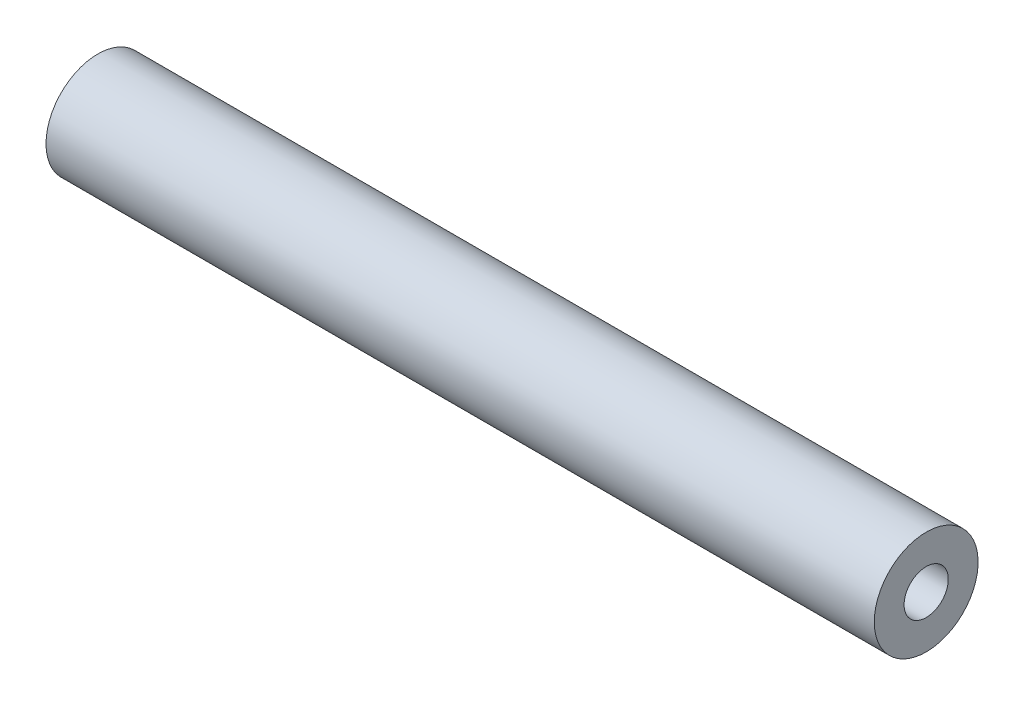
ISO-10303-21;
HEADER;
FILE_DESCRIPTION(('STEP AP214'),'2;1');
FILE_NAME('part.step','',(''),(''),'','','');
FILE_SCHEMA(('AUTOMOTIVE_DESIGN { 1 0 10303 214 1 1 1 1 }'));
ENDSEC;
DATA;
#1=APPLICATION_CONTEXT('core data for automotive mechanical design processes');
#2=APPLICATION_PROTOCOL_DEFINITION('international standard','automotive_design',2000,#1);
#3=PRODUCT_CONTEXT('',#1,'mechanical');
#4=PRODUCT('Part','Part','',(#3));
#5=PRODUCT_RELATED_PRODUCT_CATEGORY('part','',(#4));
#6=PRODUCT_DEFINITION_FORMATION('','',#4);
#7=PRODUCT_DEFINITION_CONTEXT('part definition',#1,'design');
#8=PRODUCT_DEFINITION('design','',#6,#7);
#9=PRODUCT_DEFINITION_SHAPE('','',#8);
#10=(LENGTH_UNIT() NAMED_UNIT(*) SI_UNIT(.MILLI.,.METRE.));
#11=(NAMED_UNIT(*) PLANE_ANGLE_UNIT() SI_UNIT($,.RADIAN.));
#12=(NAMED_UNIT(*) SI_UNIT($,.STERADIAN.) SOLID_ANGLE_UNIT());
#13=UNCERTAINTY_MEASURE_WITH_UNIT(LENGTH_MEASURE(1.E-05),#10,'distance_accuracy_value','');
#14=(GEOMETRIC_REPRESENTATION_CONTEXT(3) GLOBAL_UNCERTAINTY_ASSIGNED_CONTEXT((#13)) GLOBAL_UNIT_ASSIGNED_CONTEXT((#10,
#11,#12)) REPRESENTATION_CONTEXT('',''));
#15=CARTESIAN_POINT('',(0.,0.,0.));
#16=DIRECTION('',(0.,0.,1.));
#17=DIRECTION('',(1.,0.,0.));
#18=AXIS2_PLACEMENT_3D('',#15,#16,#17);
#19=CARTESIAN_POINT('',(0.,0.,-0.508));
#20=DIRECTION('',(1.,0.,0.));
#21=DIRECTION('',(0.,0.,-1.));
#22=AXIS2_PLACEMENT_3D('',#19,#20,#21);
#23=PLANE('',#22);
#24=CARTESIAN_POINT('',(0.,0.,0.));
#25=DIRECTION('',(-1.,0.,0.));
#26=DIRECTION('',(0.,0.,1.));
#27=AXIS2_PLACEMENT_3D('',#24,#25,#26);
#28=CIRCLE('',#27,0.508);
#29=CARTESIAN_POINT('',(0.,0.,0.508));
#30=VERTEX_POINT('',#29);
#31=EDGE_CURVE('E55',#30,#30,#28,.T.);
#32=ORIENTED_EDGE('',*,*,#31,.F.);
#33=EDGE_LOOP('',(#32));
#34=FACE_BOUND('',#33,.T.);
#35=CARTESIAN_POINT('',(0.,0.,0.));
#36=DIRECTION('',(-1.,0.,0.));
#37=DIRECTION('',(0.,0.,1.));
#38=AXIS2_PLACEMENT_3D('',#35,#36,#37);
#39=CIRCLE('',#38,1.1938);
#40=CARTESIAN_POINT('',(0.,0.,1.1938));
#41=VERTEX_POINT('',#40);
#42=EDGE_CURVE('E10',#41,#41,#39,.T.);
#43=ORIENTED_EDGE('',*,*,#42,.T.);
#44=EDGE_LOOP('',(#43));
#45=FACE_BOUND('',#44,.T.);
#46=ADVANCED_FACE('F41',(#34,#45),#23,.F.);
#47=CARTESIAN_POINT('',(0.,0.,0.));
#48=DIRECTION('',(-1.,0.,0.));
#49=DIRECTION('',(0.,0.,1.));
#50=AXIS2_PLACEMENT_3D('',#47,#48,#49);
#51=CYLINDRICAL_SURFACE('',#50,1.1938);
#52=ORIENTED_EDGE('',*,*,#42,.F.);
#53=EDGE_LOOP('',(#52));
#54=FACE_BOUND('',#53,.T.);
#55=CARTESIAN_POINT('',(19.05,0.,0.));
#56=DIRECTION('',(-1.,0.,0.));
#57=DIRECTION('',(0.,0.,1.));
#58=AXIS2_PLACEMENT_3D('',#55,#56,#57);
#59=CIRCLE('',#58,1.1938);
#60=CARTESIAN_POINT('',(19.05,0.,1.1938));
#61=VERTEX_POINT('',#60);
#62=EDGE_CURVE('E47',#61,#61,#59,.T.);
#63=ORIENTED_EDGE('',*,*,#62,.T.);
#64=EDGE_LOOP('',(#63));
#65=FACE_BOUND('',#64,.T.);
#66=ADVANCED_FACE('F64',(#54,#65),#51,.T.);
#67=CARTESIAN_POINT('',(19.05,0.,-0.508));
#68=DIRECTION('',(-1.,0.,0.));
#69=DIRECTION('',(0.,0.,1.));
#70=AXIS2_PLACEMENT_3D('',#67,#68,#69);
#71=PLANE('',#70);
#72=ORIENTED_EDGE('',*,*,#62,.F.);
#73=EDGE_LOOP('',(#72));
#74=FACE_BOUND('',#73,.T.);
#75=CARTESIAN_POINT('',(19.05,0.,0.));
#76=DIRECTION('',(-1.,0.,0.));
#77=DIRECTION('',(0.,0.,1.));
#78=AXIS2_PLACEMENT_3D('',#75,#76,#77);
#79=CIRCLE('',#78,0.508);
#80=CARTESIAN_POINT('',(19.05,0.,0.508));
#81=VERTEX_POINT('',#80);
#82=EDGE_CURVE('E51',#81,#81,#79,.T.);
#83=ORIENTED_EDGE('',*,*,#82,.T.);
#84=EDGE_LOOP('',(#83));
#85=FACE_BOUND('',#84,.T.);
#86=ADVANCED_FACE('F68',(#74,#85),#71,.F.);
#87=CARTESIAN_POINT('',(0.,0.,0.));
#88=DIRECTION('',(-1.,0.,0.));
#89=DIRECTION('',(0.,0.,1.));
#90=AXIS2_PLACEMENT_3D('',#87,#88,#89);
#91=CYLINDRICAL_SURFACE('',#90,0.508);
#92=ORIENTED_EDGE('',*,*,#82,.F.);
#93=EDGE_LOOP('',(#92));
#94=FACE_BOUND('',#93,.T.);
#95=ORIENTED_EDGE('',*,*,#31,.T.);
#96=EDGE_LOOP('',(#95));
#97=FACE_BOUND('',#96,.T.);
#98=ADVANCED_FACE('F61',(#94,#97),#91,.F.);
#99=CLOSED_SHELL('',(#46,#66,#86,#98));
#100=MANIFOLD_SOLID_BREP('B2',#99);
#101=ADVANCED_BREP_SHAPE_REPRESENTATION('',(#18,#100),#14);
#102=SHAPE_DEFINITION_REPRESENTATION(#9,#101);
ENDSEC;
END-ISO-10303-21;
